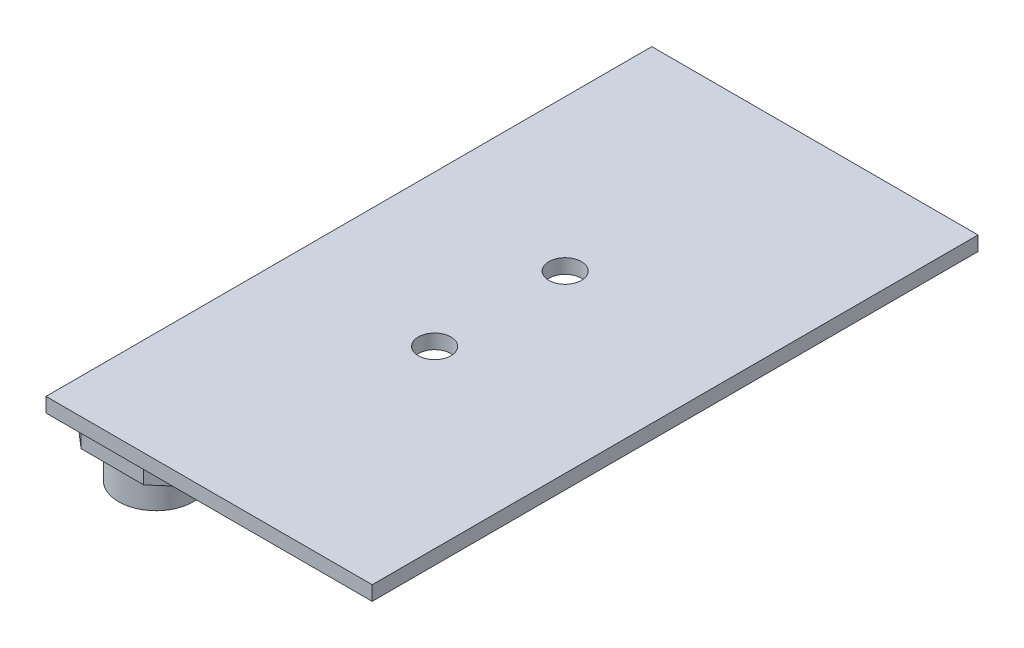
ISO-10303-21;
HEADER;
FILE_DESCRIPTION(('STEP AP214'),'2;1');
FILE_NAME('part.step','',(''),(''),'','','');
FILE_SCHEMA(('AUTOMOTIVE_DESIGN { 1 0 10303 214 1 1 1 1 }'));
ENDSEC;
DATA;
#1=APPLICATION_CONTEXT('core data for automotive mechanical design processes');
#2=APPLICATION_PROTOCOL_DEFINITION('international standard','automotive_design',2000,#1);
#3=PRODUCT_CONTEXT('',#1,'mechanical');
#4=PRODUCT('Part','Part','',(#3));
#5=PRODUCT_RELATED_PRODUCT_CATEGORY('part','',(#4));
#6=PRODUCT_DEFINITION_FORMATION('','',#4);
#7=PRODUCT_DEFINITION_CONTEXT('part definition',#1,'design');
#8=PRODUCT_DEFINITION('design','',#6,#7);
#9=PRODUCT_DEFINITION_SHAPE('','',#8);
#10=(LENGTH_UNIT() NAMED_UNIT(*) SI_UNIT(.MILLI.,.METRE.));
#11=(NAMED_UNIT(*) PLANE_ANGLE_UNIT() SI_UNIT($,.RADIAN.));
#12=(NAMED_UNIT(*) SI_UNIT($,.STERADIAN.) SOLID_ANGLE_UNIT());
#13=UNCERTAINTY_MEASURE_WITH_UNIT(LENGTH_MEASURE(1.E-05),#10,'distance_accuracy_value','');
#14=(GEOMETRIC_REPRESENTATION_CONTEXT(3) GLOBAL_UNCERTAINTY_ASSIGNED_CONTEXT((#13)) GLOBAL_UNIT_ASSIGNED_CONTEXT((#10,
#11,#12)) REPRESENTATION_CONTEXT('',''));
#15=CARTESIAN_POINT('',(0.,0.,0.));
#16=DIRECTION('',(0.,0.,1.));
#17=DIRECTION('',(1.,0.,0.));
#18=AXIS2_PLACEMENT_3D('',#15,#16,#17);
#19=CARTESIAN_POINT('',(0.,-2.375,0.));
#20=DIRECTION('',(0.,-1.,0.));
#21=DIRECTION('',(0.,0.,-1.));
#22=AXIS2_PLACEMENT_3D('',#19,#20,#21);
#23=PLANE('',#22);
#24=DIRECTION('',(-0.755489629176385,0.,-0.65516060642176));
#25=VECTOR('',#24,1.);
#26=CARTESIAN_POINT('',(-16.405,-2.375,32.33));
#27=LINE('',#26,#25);
#28=CARTESIAN_POINT('',(-16.405,-2.375,32.33));
#29=VERTEX_POINT('',#28);
#30=CARTESIAN_POINT('',(-19.53,-2.375,29.62));
#31=VERTEX_POINT('',#30);
#32=EDGE_CURVE('E157',#29,#31,#27,.T.);
#33=ORIENTED_EDGE('',*,*,#32,.T.);
#34=DIRECTION('',(0.,0.,-1.));
#35=VECTOR('',#34,1.);
#36=CARTESIAN_POINT('',(-19.53,-2.375,29.62));
#37=LINE('',#36,#35);
#38=CARTESIAN_POINT('',(-19.53,-2.375,25.68));
#39=VERTEX_POINT('',#38);
#40=EDGE_CURVE('E105',#31,#39,#37,.T.);
#41=ORIENTED_EDGE('',*,*,#40,.T.);
#42=DIRECTION('',(0.755489629176384,0.,-0.655160606421761));
#43=VECTOR('',#42,1.);
#44=CARTESIAN_POINT('',(-19.53,-2.375,25.68));
#45=LINE('',#44,#43);
#46=CARTESIAN_POINT('',(-16.405,-2.375,22.97));
#47=VERTEX_POINT('',#46);
#48=EDGE_CURVE('E172',#39,#47,#45,.T.);
#49=ORIENTED_EDGE('',*,*,#48,.T.);
#50=DIRECTION('',(1.,0.,0.));
#51=VECTOR('',#50,1.);
#52=CARTESIAN_POINT('',(-16.405,-2.375,22.97));
#53=LINE('',#52,#51);
#54=CARTESIAN_POINT('',(-9.685,-2.375,22.97));
#55=VERTEX_POINT('',#54);
#56=EDGE_CURVE('E184',#47,#55,#53,.T.);
#57=ORIENTED_EDGE('',*,*,#56,.T.);
#58=DIRECTION('',(0.755489629176385,0.,0.65516060642176));
#59=VECTOR('',#58,1.);
#60=CARTESIAN_POINT('',(-6.55999999999999,-2.375,25.68));
#61=LINE('',#60,#59);
#62=CARTESIAN_POINT('',(-6.55999999999999,-2.375,25.68));
#63=VERTEX_POINT('',#62);
#64=EDGE_CURVE('E124',#55,#63,#61,.T.);
#65=ORIENTED_EDGE('',*,*,#64,.T.);
#66=DIRECTION('',(0.,0.,1.));
#67=VECTOR('',#66,1.);
#68=CARTESIAN_POINT('',(-6.55999999999999,-2.375,29.62));
#69=LINE('',#68,#67);
#70=CARTESIAN_POINT('',(-6.55999999999999,-2.375,29.62));
#71=VERTEX_POINT('',#70);
#72=EDGE_CURVE('E118',#63,#71,#69,.T.);
#73=ORIENTED_EDGE('',*,*,#72,.T.);
#74=DIRECTION('',(-0.755489629176384,0.,0.65516060642176));
#75=VECTOR('',#74,1.);
#76=CARTESIAN_POINT('',(-9.685,-2.375,32.33));
#77=LINE('',#76,#75);
#78=CARTESIAN_POINT('',(-9.685,-2.375,32.33));
#79=VERTEX_POINT('',#78);
#80=EDGE_CURVE('E122',#71,#79,#77,.T.);
#81=ORIENTED_EDGE('',*,*,#80,.T.);
#82=DIRECTION('',(-1.,0.,0.));
#83=VECTOR('',#82,1.);
#84=CARTESIAN_POINT('',(-16.405,-2.375,32.33));
#85=LINE('',#84,#83);
#86=EDGE_CURVE('E62',#79,#29,#85,.T.);
#87=ORIENTED_EDGE('',*,*,#86,.T.);
#88=EDGE_LOOP('',(#33,#41,#49,#57,#65,#73,#81,#87));
#89=FACE_BOUND('',#88,.T.);
#90=CARTESIAN_POINT('',(-13.045,-2.375,27.65));
#91=DIRECTION('',(0.,-1.,0.));
#92=DIRECTION('',(0.,0.,-1.));
#93=AXIS2_PLACEMENT_3D('',#90,#91,#92);
#94=CIRCLE('',#93,4.);
#95=CARTESIAN_POINT('',(-13.045,-2.375,23.65));
#96=VERTEX_POINT('',#95);
#97=EDGE_CURVE('E190',#96,#96,#94,.T.);
#98=ORIENTED_EDGE('',*,*,#97,.F.);
#99=EDGE_LOOP('',(#98));
#100=FACE_BOUND('',#99,.T.);
#101=ADVANCED_FACE('F45',(#89,#100),#23,.T.);
#102=CARTESIAN_POINT('',(-16.405,-2.375,32.33));
#103=DIRECTION('',(0.65516060642176,0.,-0.755489629176385));
#104=DIRECTION('',(-0.755489629176385,0.,-0.65516060642176));
#105=AXIS2_PLACEMENT_3D('',#102,#103,#104);
#106=PLANE('',#105);
#107=DIRECTION('',(-0.755489629176385,0.,-0.65516060642176));
#108=VECTOR('',#107,1.);
#109=CARTESIAN_POINT('',(-16.405,-0.775,32.33));
#110=LINE('',#109,#108);
#111=CARTESIAN_POINT('',(-16.405,-0.775,32.33));
#112=VERTEX_POINT('',#111);
#113=CARTESIAN_POINT('',(-19.53,-0.775,29.62));
#114=VERTEX_POINT('',#113);
#115=EDGE_CURVE('E142',#112,#114,#110,.T.);
#116=ORIENTED_EDGE('',*,*,#115,.T.);
#117=DIRECTION('',(0.,1.,0.));
#118=VECTOR('',#117,1.);
#119=CARTESIAN_POINT('',(-19.53,-2.375,29.62));
#120=LINE('',#119,#118);
#121=EDGE_CURVE('E12',#31,#114,#120,.T.);
#122=ORIENTED_EDGE('',*,*,#121,.F.);
#123=ORIENTED_EDGE('',*,*,#32,.F.);
#124=DIRECTION('',(0.,1.,0.));
#125=VECTOR('',#124,1.);
#126=CARTESIAN_POINT('',(-16.405,-2.375,32.33));
#127=LINE('',#126,#125);
#128=EDGE_CURVE('E138',#29,#112,#127,.T.);
#129=ORIENTED_EDGE('',*,*,#128,.T.);
#130=EDGE_LOOP('',(#116,#122,#123,#129));
#131=FACE_BOUND('',#130,.T.);
#132=ADVANCED_FACE('F47',(#131),#106,.F.);
#133=CARTESIAN_POINT('',(-19.53,-2.375,29.62));
#134=DIRECTION('',(1.,0.,0.));
#135=DIRECTION('',(0.,0.,-1.));
#136=AXIS2_PLACEMENT_3D('',#133,#134,#135);
#137=PLANE('',#136);
#138=DIRECTION('',(0.,0.,-1.));
#139=VECTOR('',#138,1.);
#140=CARTESIAN_POINT('',(-19.53,-0.775,29.62));
#141=LINE('',#140,#139);
#142=CARTESIAN_POINT('',(-19.53,-0.775,25.68));
#143=VERTEX_POINT('',#142);
#144=EDGE_CURVE('E145',#114,#143,#141,.T.);
#145=ORIENTED_EDGE('',*,*,#144,.T.);
#146=DIRECTION('',(0.,1.,0.));
#147=VECTOR('',#146,1.);
#148=CARTESIAN_POINT('',(-19.53,-2.375,25.68));
#149=LINE('',#148,#147);
#150=EDGE_CURVE('E54',#39,#143,#149,.T.);
#151=ORIENTED_EDGE('',*,*,#150,.F.);
#152=ORIENTED_EDGE('',*,*,#40,.F.);
#153=ORIENTED_EDGE('',*,*,#121,.T.);
#154=EDGE_LOOP('',(#145,#151,#152,#153));
#155=FACE_BOUND('',#154,.T.);
#156=ADVANCED_FACE('F208',(#155),#137,.F.);
#157=CARTESIAN_POINT('',(-19.53,-2.375,25.68));
#158=DIRECTION('',(0.655160606421761,0.,0.755489629176384));
#159=DIRECTION('',(0.755489629176384,0.,-0.655160606421761));
#160=AXIS2_PLACEMENT_3D('',#157,#158,#159);
#161=PLANE('',#160);
#162=DIRECTION('',(0.755489629176384,0.,-0.655160606421761));
#163=VECTOR('',#162,1.);
#164=CARTESIAN_POINT('',(-19.53,-0.775,25.68));
#165=LINE('',#164,#163);
#166=CARTESIAN_POINT('',(-16.405,-0.775,22.97));
#167=VERTEX_POINT('',#166);
#168=EDGE_CURVE('E148',#143,#167,#165,.T.);
#169=ORIENTED_EDGE('',*,*,#168,.T.);
#170=DIRECTION('',(0.,1.,0.));
#171=VECTOR('',#170,1.);
#172=CARTESIAN_POINT('',(-16.405,-2.375,22.97));
#173=LINE('',#172,#171);
#174=EDGE_CURVE('E164',#47,#167,#173,.T.);
#175=ORIENTED_EDGE('',*,*,#174,.F.);
#176=ORIENTED_EDGE('',*,*,#48,.F.);
#177=ORIENTED_EDGE('',*,*,#150,.T.);
#178=EDGE_LOOP('',(#169,#175,#176,#177));
#179=FACE_BOUND('',#178,.T.);
#180=ADVANCED_FACE('F170',(#179),#161,.F.);
#181=CARTESIAN_POINT('',(-16.405,-2.375,22.97));
#182=DIRECTION('',(0.,0.,1.));
#183=DIRECTION('',(1.,0.,0.));
#184=AXIS2_PLACEMENT_3D('',#181,#182,#183);
#185=PLANE('',#184);
#186=DIRECTION('',(1.,0.,0.));
#187=VECTOR('',#186,1.);
#188=CARTESIAN_POINT('',(-16.405,-0.775,22.97));
#189=LINE('',#188,#187);
#190=CARTESIAN_POINT('',(-9.685,-0.775,22.97));
#191=VERTEX_POINT('',#190);
#192=EDGE_CURVE('E150',#167,#191,#189,.T.);
#193=ORIENTED_EDGE('',*,*,#192,.T.);
#194=DIRECTION('',(0.,1.,0.));
#195=VECTOR('',#194,1.);
#196=CARTESIAN_POINT('',(-9.685,-2.375,22.97));
#197=LINE('',#196,#195);
#198=EDGE_CURVE('E161',#55,#191,#197,.T.);
#199=ORIENTED_EDGE('',*,*,#198,.F.);
#200=ORIENTED_EDGE('',*,*,#56,.F.);
#201=ORIENTED_EDGE('',*,*,#174,.T.);
#202=EDGE_LOOP('',(#193,#199,#200,#201));
#203=FACE_BOUND('',#202,.T.);
#204=ADVANCED_FACE('F180',(#203),#185,.F.);
#205=CARTESIAN_POINT('',(-6.55999999999999,-2.375,25.68));
#206=DIRECTION('',(-0.65516060642176,0.,0.755489629176385));
#207=DIRECTION('',(0.755489629176385,0.,0.65516060642176));
#208=AXIS2_PLACEMENT_3D('',#205,#206,#207);
#209=PLANE('',#208);
#210=DIRECTION('',(0.755489629176385,0.,0.65516060642176));
#211=VECTOR('',#210,1.);
#212=CARTESIAN_POINT('',(-6.55999999999999,-0.775,25.68));
#213=LINE('',#212,#211);
#214=CARTESIAN_POINT('',(-6.55999999999999,-0.775,25.68));
#215=VERTEX_POINT('',#214);
#216=EDGE_CURVE('E152',#191,#215,#213,.T.);
#217=ORIENTED_EDGE('',*,*,#216,.T.);
#218=DIRECTION('',(0.,1.,0.));
#219=VECTOR('',#218,1.);
#220=CARTESIAN_POINT('',(-6.55999999999999,-2.375,25.68));
#221=LINE('',#220,#219);
#222=EDGE_CURVE('E133',#63,#215,#221,.T.);
#223=ORIENTED_EDGE('',*,*,#222,.F.);
#224=ORIENTED_EDGE('',*,*,#64,.F.);
#225=ORIENTED_EDGE('',*,*,#198,.T.);
#226=EDGE_LOOP('',(#217,#223,#224,#225));
#227=FACE_BOUND('',#226,.T.);
#228=ADVANCED_FACE('F183',(#227),#209,.F.);
#229=CARTESIAN_POINT('',(-6.55999999999999,-2.375,29.62));
#230=DIRECTION('',(-1.,0.,0.));
#231=DIRECTION('',(0.,0.,1.));
#232=AXIS2_PLACEMENT_3D('',#229,#230,#231);
#233=PLANE('',#232);
#234=DIRECTION('',(0.,0.,1.));
#235=VECTOR('',#234,1.);
#236=CARTESIAN_POINT('',(-6.55999999999999,-0.775,29.62));
#237=LINE('',#236,#235);
#238=CARTESIAN_POINT('',(-6.55999999999999,-0.775,29.62));
#239=VERTEX_POINT('',#238);
#240=EDGE_CURVE('E132',#215,#239,#237,.T.);
#241=ORIENTED_EDGE('',*,*,#240,.T.);
#242=DIRECTION('',(0.,1.,0.));
#243=VECTOR('',#242,1.);
#244=CARTESIAN_POINT('',(-6.55999999999999,-2.375,29.62));
#245=LINE('',#244,#243);
#246=EDGE_CURVE('E129',#71,#239,#245,.T.);
#247=ORIENTED_EDGE('',*,*,#246,.F.);
#248=ORIENTED_EDGE('',*,*,#72,.F.);
#249=ORIENTED_EDGE('',*,*,#222,.T.);
#250=EDGE_LOOP('',(#241,#247,#248,#249));
#251=FACE_BOUND('',#250,.T.);
#252=ADVANCED_FACE('F130',(#251),#233,.F.);
#253=CARTESIAN_POINT('',(-9.685,-2.375,32.33));
#254=DIRECTION('',(-0.65516060642176,0.,-0.755489629176384));
#255=DIRECTION('',(-0.755489629176385,0.,0.655160606421761));
#256=AXIS2_PLACEMENT_3D('',#253,#254,#255);
#257=PLANE('',#256);
#258=DIRECTION('',(-0.755489629176384,0.,0.65516060642176));
#259=VECTOR('',#258,1.);
#260=CARTESIAN_POINT('',(-9.685,-0.775,32.33));
#261=LINE('',#260,#259);
#262=CARTESIAN_POINT('',(-9.685,-0.775,32.33));
#263=VERTEX_POINT('',#262);
#264=EDGE_CURVE('E91',#239,#263,#261,.T.);
#265=ORIENTED_EDGE('',*,*,#264,.T.);
#266=DIRECTION('',(0.,1.,0.));
#267=VECTOR('',#266,1.);
#268=CARTESIAN_POINT('',(-9.685,-2.375,32.33));
#269=LINE('',#268,#267);
#270=EDGE_CURVE('E134',#79,#263,#269,.T.);
#271=ORIENTED_EDGE('',*,*,#270,.F.);
#272=ORIENTED_EDGE('',*,*,#80,.F.);
#273=ORIENTED_EDGE('',*,*,#246,.T.);
#274=EDGE_LOOP('',(#265,#271,#272,#273));
#275=FACE_BOUND('',#274,.T.);
#276=ADVANCED_FACE('F136',(#275),#257,.F.);
#277=CARTESIAN_POINT('',(-16.405,-2.375,32.33));
#278=DIRECTION('',(0.,0.,-1.));
#279=DIRECTION('',(-1.,0.,0.));
#280=AXIS2_PLACEMENT_3D('',#277,#278,#279);
#281=PLANE('',#280);
#282=DIRECTION('',(-1.,0.,0.));
#283=VECTOR('',#282,1.);
#284=CARTESIAN_POINT('',(-16.405,-0.775,32.33));
#285=LINE('',#284,#283);
#286=EDGE_CURVE('E97',#263,#112,#285,.T.);
#287=ORIENTED_EDGE('',*,*,#286,.T.);
#288=ORIENTED_EDGE('',*,*,#128,.F.);
#289=ORIENTED_EDGE('',*,*,#86,.F.);
#290=ORIENTED_EDGE('',*,*,#270,.T.);
#291=EDGE_LOOP('',(#287,#288,#289,#290));
#292=FACE_BOUND('',#291,.T.);
#293=ADVANCED_FACE('F214',(#292),#281,.F.);
#294=CARTESIAN_POINT('',(0.,-0.775,0.));
#295=DIRECTION('',(0.,-1.,0.));
#296=DIRECTION('',(0.,0.,-1.));
#297=AXIS2_PLACEMENT_3D('',#294,#295,#296);
#298=PLANE('',#297);
#299=ORIENTED_EDGE('',*,*,#115,.F.);
#300=ORIENTED_EDGE('',*,*,#286,.F.);
#301=ORIENTED_EDGE('',*,*,#264,.F.);
#302=ORIENTED_EDGE('',*,*,#240,.F.);
#303=ORIENTED_EDGE('',*,*,#216,.F.);
#304=ORIENTED_EDGE('',*,*,#192,.F.);
#305=ORIENTED_EDGE('',*,*,#168,.F.);
#306=ORIENTED_EDGE('',*,*,#144,.F.);
#307=EDGE_LOOP('',(#299,#300,#301,#302,#303,#304,#305,#306));
#308=FACE_BOUND('',#307,.T.);
#309=ADVANCED_FACE('F176',(#308),#298,.F.);
#310=CARTESIAN_POINT('',(-13.045,-5.975,27.65));
#311=DIRECTION('',(0.,1.,0.));
#312=DIRECTION('',(0.,0.,1.));
#313=AXIS2_PLACEMENT_3D('',#310,#311,#312);
#314=CYLINDRICAL_SURFACE('',#313,4.);
#315=CARTESIAN_POINT('',(-13.045,-5.975,27.65));
#316=DIRECTION('',(0.,-1.,0.));
#317=DIRECTION('',(0.,0.,-1.));
#318=AXIS2_PLACEMENT_3D('',#315,#316,#317);
#319=CIRCLE('',#318,4.);
#320=CARTESIAN_POINT('',(-13.045,-5.975,23.65));
#321=VERTEX_POINT('',#320);
#322=EDGE_CURVE('E146',#321,#321,#319,.T.);
#323=ORIENTED_EDGE('',*,*,#322,.F.);
#324=EDGE_LOOP('',(#323));
#325=FACE_BOUND('',#324,.T.);
#326=ORIENTED_EDGE('',*,*,#97,.T.);
#327=EDGE_LOOP('',(#326));
#328=FACE_BOUND('',#327,.T.);
#329=ADVANCED_FACE('F198',(#325,#328),#314,.T.);
#330=CARTESIAN_POINT('',(-13.045,-5.975,27.65));
#331=DIRECTION('',(0.,-1.,0.));
#332=DIRECTION('',(0.,0.,-1.));
#333=AXIS2_PLACEMENT_3D('',#330,#331,#332);
#334=PLANE('',#333);
#335=ORIENTED_EDGE('',*,*,#322,.T.);
#336=EDGE_LOOP('',(#335));
#337=FACE_BOUND('',#336,.T.);
#338=ADVANCED_FACE('F196',(#337),#334,.T.);
#339=CLOSED_SHELL('',(#101,#132,#156,#180,#204,#228,#252,#276,#293,#309,#329,#338));
#340=MANIFOLD_SOLID_BREP('B2',#339);
#341=CARTESIAN_POINT('',(-19.18,-4.325,19.33));
#342=DIRECTION('',(1.,0.,0.));
#343=DIRECTION('',(0.,0.,-1.));
#344=AXIS2_PLACEMENT_3D('',#341,#342,#343);
#345=PLANE('',#344);
#346=DIRECTION('',(0.,0.,-1.));
#347=VECTOR('',#346,1.);
#348=CARTESIAN_POINT('',(-19.18,-0.775,19.33));
#349=LINE('',#348,#347);
#350=CARTESIAN_POINT('',(-19.18,-0.775,19.33));
#351=VERTEX_POINT('',#350);
#352=CARTESIAN_POINT('',(-19.18,-0.775,11.93));
#353=VERTEX_POINT('',#352);
#354=EDGE_CURVE('E374',#351,#353,#349,.T.);
#355=ORIENTED_EDGE('',*,*,#354,.T.);
#356=DIRECTION('',(0.,1.,0.));
#357=VECTOR('',#356,1.);
#358=CARTESIAN_POINT('',(-19.18,-4.325,11.93));
#359=LINE('',#358,#357);
#360=CARTESIAN_POINT('',(-19.18,-4.325,11.93));
#361=VERTEX_POINT('',#360);
#362=EDGE_CURVE('E43',#361,#353,#359,.T.);
#363=ORIENTED_EDGE('',*,*,#362,.F.);
#364=DIRECTION('',(0.,0.,-1.));
#365=VECTOR('',#364,1.);
#366=CARTESIAN_POINT('',(-19.18,-4.325,19.33));
#367=LINE('',#366,#365);
#368=CARTESIAN_POINT('',(-19.18,-4.325,19.33));
#369=VERTEX_POINT('',#368);
#370=EDGE_CURVE('E362',#369,#361,#367,.T.);
#371=ORIENTED_EDGE('',*,*,#370,.F.);
#372=DIRECTION('',(0.,1.,0.));
#373=VECTOR('',#372,1.);
#374=CARTESIAN_POINT('',(-19.18,-4.325,19.33));
#375=LINE('',#374,#373);
#376=EDGE_CURVE('E370',#369,#351,#375,.T.);
#377=ORIENTED_EDGE('',*,*,#376,.T.);
#378=EDGE_LOOP('',(#355,#363,#371,#377));
#379=FACE_BOUND('',#378,.T.);
#380=ADVANCED_FACE('F311',(#379),#345,.F.);
#381=CARTESIAN_POINT('',(-19.18,-4.325,11.93));
#382=DIRECTION('',(0.,0.,1.));
#383=DIRECTION('',(1.,0.,0.));
#384=AXIS2_PLACEMENT_3D('',#381,#382,#383);
#385=PLANE('',#384);
#386=DIRECTION('',(1.,0.,0.));
#387=VECTOR('',#386,1.);
#388=CARTESIAN_POINT('',(-19.18,-0.775,11.93));
#389=LINE('',#388,#387);
#390=CARTESIAN_POINT('',(-11.78,-0.775,11.93));
#391=VERTEX_POINT('',#390);
#392=EDGE_CURVE('E366',#353,#391,#389,.T.);
#393=ORIENTED_EDGE('',*,*,#392,.T.);
#394=DIRECTION('',(0.,1.,0.));
#395=VECTOR('',#394,1.);
#396=CARTESIAN_POINT('',(-11.78,-4.325,11.93));
#397=LINE('',#396,#395);
#398=CARTESIAN_POINT('',(-11.78,-4.325,11.93));
#399=VERTEX_POINT('',#398);
#400=EDGE_CURVE('E319',#399,#391,#397,.T.);
#401=ORIENTED_EDGE('',*,*,#400,.F.);
#402=DIRECTION('',(1.,0.,0.));
#403=VECTOR('',#402,1.);
#404=CARTESIAN_POINT('',(-19.18,-4.325,11.93));
#405=LINE('',#404,#403);
#406=EDGE_CURVE('E357',#361,#399,#405,.T.);
#407=ORIENTED_EDGE('',*,*,#406,.F.);
#408=ORIENTED_EDGE('',*,*,#362,.T.);
#409=EDGE_LOOP('',(#393,#401,#407,#408));
#410=FACE_BOUND('',#409,.T.);
#411=ADVANCED_FACE('F365',(#410),#385,.F.);
#412=CARTESIAN_POINT('',(-11.78,-4.325,19.33));
#413=DIRECTION('',(-1.,0.,0.));
#414=DIRECTION('',(0.,0.,1.));
#415=AXIS2_PLACEMENT_3D('',#412,#413,#414);
#416=PLANE('',#415);
#417=DIRECTION('',(0.,0.,1.));
#418=VECTOR('',#417,1.);
#419=CARTESIAN_POINT('',(-11.78,-0.775,19.33));
#420=LINE('',#419,#418);
#421=CARTESIAN_POINT('',(-11.78,-0.775,19.33));
#422=VERTEX_POINT('',#421);
#423=EDGE_CURVE('E344',#391,#422,#420,.T.);
#424=ORIENTED_EDGE('',*,*,#423,.T.);
#425=DIRECTION('',(0.,1.,0.));
#426=VECTOR('',#425,1.);
#427=CARTESIAN_POINT('',(-11.78,-4.325,19.33));
#428=LINE('',#427,#426);
#429=CARTESIAN_POINT('',(-11.78,-4.325,19.33));
#430=VERTEX_POINT('',#429);
#431=EDGE_CURVE('E367',#430,#422,#428,.T.);
#432=ORIENTED_EDGE('',*,*,#431,.F.);
#433=DIRECTION('',(0.,0.,1.));
#434=VECTOR('',#433,1.);
#435=CARTESIAN_POINT('',(-11.78,-4.325,19.33));
#436=LINE('',#435,#434);
#437=EDGE_CURVE('E360',#399,#430,#436,.T.);
#438=ORIENTED_EDGE('',*,*,#437,.F.);
#439=ORIENTED_EDGE('',*,*,#400,.T.);
#440=EDGE_LOOP('',(#424,#432,#438,#439));
#441=FACE_BOUND('',#440,.T.);
#442=ADVANCED_FACE('F368',(#441),#416,.F.);
#443=CARTESIAN_POINT('',(-19.18,-4.325,19.33));
#444=DIRECTION('',(0.,0.,-1.));
#445=DIRECTION('',(-1.,0.,0.));
#446=AXIS2_PLACEMENT_3D('',#443,#444,#445);
#447=PLANE('',#446);
#448=DIRECTION('',(-1.,0.,0.));
#449=VECTOR('',#448,1.);
#450=CARTESIAN_POINT('',(-19.18,-0.775,19.33));
#451=LINE('',#450,#449);
#452=EDGE_CURVE('E350',#422,#351,#451,.T.);
#453=ORIENTED_EDGE('',*,*,#452,.T.);
#454=ORIENTED_EDGE('',*,*,#376,.F.);
#455=DIRECTION('',(-1.,0.,0.));
#456=VECTOR('',#455,1.);
#457=CARTESIAN_POINT('',(-19.18,-4.325,19.33));
#458=LINE('',#457,#456);
#459=EDGE_CURVE('E327',#430,#369,#458,.T.);
#460=ORIENTED_EDGE('',*,*,#459,.F.);
#461=ORIENTED_EDGE('',*,*,#431,.T.);
#462=EDGE_LOOP('',(#453,#454,#460,#461));
#463=FACE_BOUND('',#462,.T.);
#464=ADVANCED_FACE('F381',(#463),#447,.F.);
#465=CARTESIAN_POINT('',(0.,-4.325,0.));
#466=DIRECTION('',(0.,-1.,0.));
#467=DIRECTION('',(0.,0.,-1.));
#468=AXIS2_PLACEMENT_3D('',#465,#466,#467);
#469=PLANE('',#468);
#470=ORIENTED_EDGE('',*,*,#370,.T.);
#471=ORIENTED_EDGE('',*,*,#406,.T.);
#472=ORIENTED_EDGE('',*,*,#437,.T.);
#473=ORIENTED_EDGE('',*,*,#459,.T.);
#474=EDGE_LOOP('',(#470,#471,#472,#473));
#475=FACE_BOUND('',#474,.T.);
#476=ADVANCED_FACE('F358',(#475),#469,.T.);
#477=CARTESIAN_POINT('',(0.,-0.775,0.));
#478=DIRECTION('',(0.,-1.,0.));
#479=DIRECTION('',(0.,0.,-1.));
#480=AXIS2_PLACEMENT_3D('',#477,#478,#479);
#481=PLANE('',#480);
#482=ORIENTED_EDGE('',*,*,#354,.F.);
#483=ORIENTED_EDGE('',*,*,#452,.F.);
#484=ORIENTED_EDGE('',*,*,#423,.F.);
#485=ORIENTED_EDGE('',*,*,#392,.F.);
#486=EDGE_LOOP('',(#482,#483,#484,#485));
#487=FACE_BOUND('',#486,.T.);
#488=ADVANCED_FACE('F384',(#487),#481,.F.);
#489=CLOSED_SHELL('',(#380,#411,#442,#464,#476,#488));
#490=MANIFOLD_SOLID_BREP('B6',#489);
#491=CARTESIAN_POINT('',(-20.,0.775,-32.5));
#492=DIRECTION('',(1.,0.,0.));
#493=DIRECTION('',(0.,0.,-1.));
#494=AXIS2_PLACEMENT_3D('',#491,#492,#493);
#495=PLANE('',#494);
#496=DIRECTION('',(0.,0.,1.));
#497=VECTOR('',#496,1.);
#498=CARTESIAN_POINT('',(-20.,-0.775,-32.5));
#499=LINE('',#498,#497);
#500=CARTESIAN_POINT('',(-20.,-0.775,-32.5));
#501=VERTEX_POINT('',#500);
#502=CARTESIAN_POINT('',(-20.,-0.775,32.5));
#503=VERTEX_POINT('',#502);
#504=EDGE_CURVE('E497',#501,#503,#499,.T.);
#505=ORIENTED_EDGE('',*,*,#504,.T.);
#506=DIRECTION('',(0.,-1.,0.));
#507=VECTOR('',#506,1.);
#508=CARTESIAN_POINT('',(-20.,0.775,32.5));
#509=LINE('',#508,#507);
#510=CARTESIAN_POINT('',(-20.,0.775,32.5));
#511=VERTEX_POINT('',#510);
#512=EDGE_CURVE('E309',#511,#503,#509,.T.);
#513=ORIENTED_EDGE('',*,*,#512,.F.);
#514=DIRECTION('',(0.,0.,1.));
#515=VECTOR('',#514,1.);
#516=CARTESIAN_POINT('',(-20.,0.775,-32.5));
#517=LINE('',#516,#515);
#518=CARTESIAN_POINT('',(-20.,0.775,-32.5));
#519=VERTEX_POINT('',#518);
#520=EDGE_CURVE('E485',#519,#511,#517,.T.);
#521=ORIENTED_EDGE('',*,*,#520,.F.);
#522=DIRECTION('',(0.,-1.,0.));
#523=VECTOR('',#522,1.);
#524=CARTESIAN_POINT('',(-20.,0.775,-32.5));
#525=LINE('',#524,#523);
#526=EDGE_CURVE('E493',#519,#501,#525,.T.);
#527=ORIENTED_EDGE('',*,*,#526,.T.);
#528=EDGE_LOOP('',(#505,#513,#521,#527));
#529=FACE_BOUND('',#528,.T.);
#530=ADVANCED_FACE('F434',(#529),#495,.F.);
#531=CARTESIAN_POINT('',(-20.,0.775,32.5));
#532=DIRECTION('',(0.,0.,-1.));
#533=DIRECTION('',(-1.,0.,0.));
#534=AXIS2_PLACEMENT_3D('',#531,#532,#533);
#535=PLANE('',#534);
#536=DIRECTION('',(1.,0.,0.));
#537=VECTOR('',#536,1.);
#538=CARTESIAN_POINT('',(-20.,-0.775,32.5));
#539=LINE('',#538,#537);
#540=CARTESIAN_POINT('',(15.,-0.775,32.5));
#541=VERTEX_POINT('',#540);
#542=EDGE_CURVE('E489',#503,#541,#539,.T.);
#543=ORIENTED_EDGE('',*,*,#542,.T.);
#544=DIRECTION('',(0.,-1.,0.));
#545=VECTOR('',#544,1.);
#546=CARTESIAN_POINT('',(15.,0.775,32.5));
#547=LINE('',#546,#545);
#548=CARTESIAN_POINT('',(15.,0.775,32.5));
#549=VERTEX_POINT('',#548);
#550=EDGE_CURVE('E442',#549,#541,#547,.T.);
#551=ORIENTED_EDGE('',*,*,#550,.F.);
#552=DIRECTION('',(1.,0.,0.));
#553=VECTOR('',#552,1.);
#554=CARTESIAN_POINT('',(-20.,0.775,32.5));
#555=LINE('',#554,#553);
#556=EDGE_CURVE('E480',#511,#549,#555,.T.);
#557=ORIENTED_EDGE('',*,*,#556,.F.);
#558=ORIENTED_EDGE('',*,*,#512,.T.);
#559=EDGE_LOOP('',(#543,#551,#557,#558));
#560=FACE_BOUND('',#559,.T.);
#561=ADVANCED_FACE('F488',(#560),#535,.F.);
#562=CARTESIAN_POINT('',(15.,0.775,-32.5));
#563=DIRECTION('',(-1.,0.,0.));
#564=DIRECTION('',(0.,0.,1.));
#565=AXIS2_PLACEMENT_3D('',#562,#563,#564);
#566=PLANE('',#565);
#567=DIRECTION('',(0.,0.,-1.));
#568=VECTOR('',#567,1.);
#569=CARTESIAN_POINT('',(15.,-0.775,-32.5));
#570=LINE('',#569,#568);
#571=CARTESIAN_POINT('',(15.,-0.775,-32.5));
#572=VERTEX_POINT('',#571);
#573=EDGE_CURVE('E467',#541,#572,#570,.T.);
#574=ORIENTED_EDGE('',*,*,#573,.T.);
#575=DIRECTION('',(0.,-1.,0.));
#576=VECTOR('',#575,1.);
#577=CARTESIAN_POINT('',(15.,0.775,-32.5));
#578=LINE('',#577,#576);
#579=CARTESIAN_POINT('',(15.,0.775,-32.5));
#580=VERTEX_POINT('',#579);
#581=EDGE_CURVE('E490',#580,#572,#578,.T.);
#582=ORIENTED_EDGE('',*,*,#581,.F.);
#583=DIRECTION('',(0.,0.,-1.));
#584=VECTOR('',#583,1.);
#585=CARTESIAN_POINT('',(15.,0.775,-32.5));
#586=LINE('',#585,#584);
#587=EDGE_CURVE('E483',#549,#580,#586,.T.);
#588=ORIENTED_EDGE('',*,*,#587,.F.);
#589=ORIENTED_EDGE('',*,*,#550,.T.);
#590=EDGE_LOOP('',(#574,#582,#588,#589));
#591=FACE_BOUND('',#590,.T.);
#592=ADVANCED_FACE('F491',(#591),#566,.F.);
#593=CARTESIAN_POINT('',(-20.,0.775,-32.5));
#594=DIRECTION('',(0.,0.,1.));
#595=DIRECTION('',(1.,0.,0.));
#596=AXIS2_PLACEMENT_3D('',#593,#594,#595);
#597=PLANE('',#596);
#598=DIRECTION('',(-1.,0.,0.));
#599=VECTOR('',#598,1.);
#600=CARTESIAN_POINT('',(-20.,-0.775,-32.5));
#601=LINE('',#600,#599);
#602=EDGE_CURVE('E473',#572,#501,#601,.T.);
#603=ORIENTED_EDGE('',*,*,#602,.T.);
#604=ORIENTED_EDGE('',*,*,#526,.F.);
#605=DIRECTION('',(-1.,0.,0.));
#606=VECTOR('',#605,1.);
#607=CARTESIAN_POINT('',(-20.,0.775,-32.5));
#608=LINE('',#607,#606);
#609=EDGE_CURVE('E450',#580,#519,#608,.T.);
#610=ORIENTED_EDGE('',*,*,#609,.F.);
#611=ORIENTED_EDGE('',*,*,#581,.T.);
#612=EDGE_LOOP('',(#603,#604,#610,#611));
#613=FACE_BOUND('',#612,.T.);
#614=ADVANCED_FACE('F505',(#613),#597,.F.);
#615=CARTESIAN_POINT('',(0.,0.775,0.));
#616=DIRECTION('',(0.,1.,0.));
#617=DIRECTION('',(0.,0.,1.));
#618=AXIS2_PLACEMENT_3D('',#615,#616,#617);
#619=PLANE('',#618);
#620=CARTESIAN_POINT('',(-3.8,0.775,-7.));
#621=DIRECTION('',(0.,-1.,0.));
#622=DIRECTION('',(0.,0.,1.));
#623=AXIS2_PLACEMENT_3D('',#620,#621,#622);
#624=CIRCLE('',#623,1.75000000000001);
#625=CARTESIAN_POINT('',(-3.8,0.775,-8.75000000000001));
#626=VERTEX_POINT('',#625);
#627=EDGE_CURVE('E514',#626,#626,#624,.T.);
#628=ORIENTED_EDGE('',*,*,#627,.T.);
#629=EDGE_LOOP('',(#628));
#630=FACE_BOUND('',#629,.T.);
#631=CARTESIAN_POINT('',(-3.8,0.775,7.));
#632=DIRECTION('',(0.,-1.,0.));
#633=DIRECTION('',(0.,0.,-1.));
#634=AXIS2_PLACEMENT_3D('',#631,#632,#633);
#635=CIRCLE('',#634,1.75000000000001);
#636=CARTESIAN_POINT('',(-3.8,0.775,5.24999999999999));
#637=VERTEX_POINT('',#636);
#638=EDGE_CURVE('E500',#637,#637,#635,.T.);
#639=ORIENTED_EDGE('',*,*,#638,.T.);
#640=EDGE_LOOP('',(#639));
#641=FACE_BOUND('',#640,.T.);
#642=ORIENTED_EDGE('',*,*,#520,.T.);
#643=ORIENTED_EDGE('',*,*,#556,.T.);
#644=ORIENTED_EDGE('',*,*,#587,.T.);
#645=ORIENTED_EDGE('',*,*,#609,.T.);
#646=EDGE_LOOP('',(#642,#643,#644,#645));
#647=FACE_BOUND('',#646,.T.);
#648=ADVANCED_FACE('F481',(#630,#641,#647),#619,.T.);
#649=CARTESIAN_POINT('',(0.,-0.775,0.));
#650=DIRECTION('',(0.,1.,0.));
#651=DIRECTION('',(0.,0.,1.));
#652=AXIS2_PLACEMENT_3D('',#649,#650,#651);
#653=PLANE('',#652);
#654=CARTESIAN_POINT('',(-3.8,-0.775,-7.));
#655=DIRECTION('',(0.,-1.,0.));
#656=DIRECTION('',(0.,0.,1.));
#657=AXIS2_PLACEMENT_3D('',#654,#655,#656);
#658=CIRCLE('',#657,1.75000000000001);
#659=CARTESIAN_POINT('',(-3.8,-0.775,-8.75000000000001));
#660=VERTEX_POINT('',#659);
#661=EDGE_CURVE('E517',#660,#660,#658,.T.);
#662=ORIENTED_EDGE('',*,*,#661,.F.);
#663=EDGE_LOOP('',(#662));
#664=FACE_BOUND('',#663,.T.);
#665=CARTESIAN_POINT('',(-3.8,-0.775,7.));
#666=DIRECTION('',(0.,-1.,0.));
#667=DIRECTION('',(0.,0.,-1.));
#668=AXIS2_PLACEMENT_3D('',#665,#666,#667);
#669=CIRCLE('',#668,1.75000000000001);
#670=CARTESIAN_POINT('',(-3.8,-0.775,5.24999999999999));
#671=VERTEX_POINT('',#670);
#672=EDGE_CURVE('E511',#671,#671,#669,.T.);
#673=ORIENTED_EDGE('',*,*,#672,.F.);
#674=EDGE_LOOP('',(#673));
#675=FACE_BOUND('',#674,.T.);
#676=ORIENTED_EDGE('',*,*,#504,.F.);
#677=ORIENTED_EDGE('',*,*,#602,.F.);
#678=ORIENTED_EDGE('',*,*,#573,.F.);
#679=ORIENTED_EDGE('',*,*,#542,.F.);
#680=EDGE_LOOP('',(#676,#677,#678,#679));
#681=FACE_BOUND('',#680,.T.);
#682=ADVANCED_FACE('F508',(#664,#675,#681),#653,.F.);
#683=CARTESIAN_POINT('',(-3.8,0.775,7.));
#684=DIRECTION('',(0.,-1.,0.));
#685=DIRECTION('',(0.,0.,-1.));
#686=AXIS2_PLACEMENT_3D('',#683,#684,#685);
#687=CYLINDRICAL_SURFACE('',#686,1.75000000000001);
#688=CARTESIAN_POINT('',(-3.8,0.775,5.24999999999999));
#689=CARTESIAN_POINT('',(-3.8,0.758854166666667,5.24999999999999));
#690=CARTESIAN_POINT('',(-3.8,0.742708333333333,5.24999999999999));
#691=CARTESIAN_POINT('',(-3.8,0.710416666666667,5.24999999999999));
#692=CARTESIAN_POINT('',(-3.8,0.694270833333333,5.24999999999999));
#693=CARTESIAN_POINT('',(-3.8,0.661979166666667,5.24999999999999));
#694=CARTESIAN_POINT('',(-3.8,0.645833333333333,5.24999999999999));
#695=CARTESIAN_POINT('',(-3.8,0.613541666666667,5.24999999999999));
#696=CARTESIAN_POINT('',(-3.8,0.597395833333333,5.24999999999999));
#697=CARTESIAN_POINT('',(-3.8,0.565104166666667,5.24999999999999));
#698=CARTESIAN_POINT('',(-3.8,0.548958333333333,5.24999999999999));
#699=CARTESIAN_POINT('',(-3.8,0.516666666666667,5.24999999999999));
#700=CARTESIAN_POINT('',(-3.8,0.500520833333333,5.24999999999999));
#701=CARTESIAN_POINT('',(-3.8,0.468229166666667,5.24999999999999));
#702=CARTESIAN_POINT('',(-3.8,0.452083333333333,5.24999999999999));
#703=CARTESIAN_POINT('',(-3.8,0.419791666666667,5.24999999999999));
#704=CARTESIAN_POINT('',(-3.8,0.403645833333333,5.24999999999999));
#705=CARTESIAN_POINT('',(-3.8,0.371354166666667,5.24999999999999));
#706=CARTESIAN_POINT('',(-3.8,0.355208333333333,5.24999999999999));
#707=CARTESIAN_POINT('',(-3.8,0.322916666666667,5.24999999999999));
#708=CARTESIAN_POINT('',(-3.8,0.306770833333333,5.24999999999999));
#709=CARTESIAN_POINT('',(-3.8,0.274479166666667,5.24999999999999));
#710=CARTESIAN_POINT('',(-3.8,0.258333333333333,5.24999999999999));
#711=CARTESIAN_POINT('',(-3.8,0.226041666666667,5.24999999999999));
#712=CARTESIAN_POINT('',(-3.8,0.209895833333333,5.24999999999999));
#713=CARTESIAN_POINT('',(-3.8,0.177604166666667,5.24999999999999));
#714=CARTESIAN_POINT('',(-3.8,0.161458333333333,5.24999999999999));
#715=CARTESIAN_POINT('',(-3.8,0.129166666666667,5.24999999999999));
#716=CARTESIAN_POINT('',(-3.8,0.113020833333333,5.24999999999999));
#717=CARTESIAN_POINT('',(-3.8,0.0807291666666667,5.24999999999999));
#718=CARTESIAN_POINT('',(-3.8,0.0645833333333334,5.24999999999999));
#719=CARTESIAN_POINT('',(-3.8,0.0322916666666668,5.24999999999999));
#720=CARTESIAN_POINT('',(-3.8,0.0161458333333334,5.24999999999999));
#721=CARTESIAN_POINT('',(-3.8,-0.0161458333333332,5.24999999999999));
#722=CARTESIAN_POINT('',(-3.8,-0.0322916666666665,5.24999999999999));
#723=CARTESIAN_POINT('',(-3.8,-0.0645833333333332,5.24999999999999));
#724=CARTESIAN_POINT('',(-3.8,-0.0807291666666665,5.24999999999999));
#725=CARTESIAN_POINT('',(-3.8,-0.113020833333333,5.24999999999999));
#726=CARTESIAN_POINT('',(-3.8,-0.129166666666667,5.24999999999999));
#727=CARTESIAN_POINT('',(-3.8,-0.161458333333333,5.24999999999999));
#728=CARTESIAN_POINT('',(-3.8,-0.177604166666667,5.24999999999999));
#729=CARTESIAN_POINT('',(-3.8,-0.209895833333333,5.24999999999999));
#730=CARTESIAN_POINT('',(-3.8,-0.226041666666667,5.24999999999999));
#731=CARTESIAN_POINT('',(-3.8,-0.258333333333333,5.24999999999999));
#732=CARTESIAN_POINT('',(-3.8,-0.274479166666667,5.24999999999999));
#733=CARTESIAN_POINT('',(-3.8,-0.306770833333333,5.24999999999999));
#734=CARTESIAN_POINT('',(-3.8,-0.322916666666667,5.24999999999999));
#735=CARTESIAN_POINT('',(-3.8,-0.355208333333333,5.24999999999999));
#736=CARTESIAN_POINT('',(-3.8,-0.371354166666667,5.24999999999999));
#737=CARTESIAN_POINT('',(-3.8,-0.403645833333333,5.24999999999999));
#738=CARTESIAN_POINT('',(-3.8,-0.419791666666667,5.24999999999999));
#739=CARTESIAN_POINT('',(-3.8,-0.452083333333333,5.24999999999999));
#740=CARTESIAN_POINT('',(-3.8,-0.468229166666667,5.24999999999999));
#741=CARTESIAN_POINT('',(-3.8,-0.500520833333333,5.24999999999999));
#742=CARTESIAN_POINT('',(-3.8,-0.516666666666667,5.24999999999999));
#743=CARTESIAN_POINT('',(-3.8,-0.548958333333333,5.24999999999999));
#744=CARTESIAN_POINT('',(-3.8,-0.565104166666667,5.24999999999999));
#745=CARTESIAN_POINT('',(-3.8,-0.597395833333333,5.24999999999999));
#746=CARTESIAN_POINT('',(-3.8,-0.613541666666667,5.24999999999999));
#747=CARTESIAN_POINT('',(-3.8,-0.645833333333333,5.24999999999999));
#748=CARTESIAN_POINT('',(-3.8,-0.661979166666667,5.24999999999999));
#749=CARTESIAN_POINT('',(-3.8,-0.694270833333333,5.24999999999999));
#750=CARTESIAN_POINT('',(-3.8,-0.710416666666667,5.24999999999999));
#751=CARTESIAN_POINT('',(-3.8,-0.742708333333333,5.24999999999999));
#752=CARTESIAN_POINT('',(-3.8,-0.758854166666667,5.24999999999999));
#753=CARTESIAN_POINT('',(-3.8,-0.775,5.24999999999999));
#754=B_SPLINE_CURVE_WITH_KNOTS('',3,(#688,#689,#690,#691,#692,#693,#694,#695,#696,#697,#698,
#699,#700,#701,#702,#703,#704,#705,#706,#707,#708,#709,#710,#711,#712,#713,#714,#715,#716,#717,
#718,#719,#720,#721,#722,#723,#724,#725,#726,#727,#728,#729,#730,#731,#732,#733,#734,#735,#736,
#737,#738,#739,#740,#741,#742,#743,#744,#745,#746,#747,#748,#749,#750,#751,#752,#753),
.UNSPECIFIED.,.F.,.F.,(4,2,2,2,2,2,2,2,2,2,2,2,2,2,2,2,2,2,2,2,2,2,2,2,2,2,2,2,2,2,2,2,4),(0.,
0.0484375000000001,0.0968750000000001,0.1453125,0.19375,0.2421875,0.290625,0.3390625,0.3875,
0.4359375,0.484375,0.5328125,0.58125,0.6296875,0.678125,0.7265625,0.775,0.8234375,0.871875,
0.9203125,0.96875,1.0171875,1.065625,1.1140625,1.1625,1.2109375,1.259375,1.3078125,1.35625,
1.4046875,1.453125,1.5015625,1.55),.UNSPECIFIED.);
#755=EDGE_CURVE('BSEAM528',#637,#671,#754,.T.);
#756=ORIENTED_EDGE('',*,*,#638,.F.);
#757=ORIENTED_EDGE('',*,*,#672,.T.);
#758=ORIENTED_EDGE('',*,*,#755,.T.);
#759=ORIENTED_EDGE('',*,*,#755,.F.);
#760=EDGE_LOOP('',(#756,#758,#757,#759));
#761=FACE_BOUND('',#760,.T.);
#762=ADVANCED_FACE('F528',(#761),#687,.F.);
#763=CARTESIAN_POINT('',(-3.8,0.775,-7.));
#764=DIRECTION('',(0.,-1.,0.));
#765=DIRECTION('',(0.,0.,-1.));
#766=AXIS2_PLACEMENT_3D('',#763,#764,#765);
#767=CYLINDRICAL_SURFACE('',#766,1.75000000000001);
#768=CARTESIAN_POINT('',(-3.8,0.775,-8.75000000000001));
#769=CARTESIAN_POINT('',(-3.8,0.758854166666667,-8.75000000000001));
#770=CARTESIAN_POINT('',(-3.8,0.742708333333333,-8.75000000000001));
#771=CARTESIAN_POINT('',(-3.8,0.710416666666667,-8.75000000000001));
#772=CARTESIAN_POINT('',(-3.8,0.694270833333333,-8.75000000000001));
#773=CARTESIAN_POINT('',(-3.8,0.661979166666667,-8.75000000000001));
#774=CARTESIAN_POINT('',(-3.8,0.645833333333333,-8.75000000000001));
#775=CARTESIAN_POINT('',(-3.8,0.613541666666667,-8.75000000000001));
#776=CARTESIAN_POINT('',(-3.8,0.597395833333333,-8.75000000000001));
#777=CARTESIAN_POINT('',(-3.8,0.565104166666667,-8.75000000000001));
#778=CARTESIAN_POINT('',(-3.8,0.548958333333333,-8.75000000000001));
#779=CARTESIAN_POINT('',(-3.8,0.516666666666667,-8.75000000000001));
#780=CARTESIAN_POINT('',(-3.8,0.500520833333333,-8.75000000000001));
#781=CARTESIAN_POINT('',(-3.8,0.468229166666667,-8.75000000000001));
#782=CARTESIAN_POINT('',(-3.8,0.452083333333333,-8.75000000000001));
#783=CARTESIAN_POINT('',(-3.8,0.419791666666667,-8.75000000000001));
#784=CARTESIAN_POINT('',(-3.8,0.403645833333333,-8.75000000000001));
#785=CARTESIAN_POINT('',(-3.8,0.371354166666667,-8.75000000000001));
#786=CARTESIAN_POINT('',(-3.8,0.355208333333333,-8.75000000000001));
#787=CARTESIAN_POINT('',(-3.8,0.322916666666667,-8.75000000000001));
#788=CARTESIAN_POINT('',(-3.8,0.306770833333333,-8.75000000000001));
#789=CARTESIAN_POINT('',(-3.8,0.274479166666667,-8.75000000000001));
#790=CARTESIAN_POINT('',(-3.8,0.258333333333333,-8.75000000000001));
#791=CARTESIAN_POINT('',(-3.8,0.226041666666667,-8.75000000000001));
#792=CARTESIAN_POINT('',(-3.8,0.209895833333333,-8.75000000000001));
#793=CARTESIAN_POINT('',(-3.8,0.177604166666667,-8.75000000000001));
#794=CARTESIAN_POINT('',(-3.8,0.161458333333333,-8.75000000000001));
#795=CARTESIAN_POINT('',(-3.8,0.129166666666667,-8.75000000000001));
#796=CARTESIAN_POINT('',(-3.8,0.113020833333333,-8.75000000000001));
#797=CARTESIAN_POINT('',(-3.8,0.0807291666666667,-8.75000000000001));
#798=CARTESIAN_POINT('',(-3.8,0.0645833333333334,-8.75000000000001));
#799=CARTESIAN_POINT('',(-3.8,0.0322916666666668,-8.75000000000001));
#800=CARTESIAN_POINT('',(-3.8,0.0161458333333334,-8.75000000000001));
#801=CARTESIAN_POINT('',(-3.8,-0.0161458333333332,-8.75000000000001));
#802=CARTESIAN_POINT('',(-3.8,-0.0322916666666665,-8.75000000000001));
#803=CARTESIAN_POINT('',(-3.8,-0.0645833333333332,-8.75000000000001));
#804=CARTESIAN_POINT('',(-3.8,-0.0807291666666665,-8.75000000000001));
#805=CARTESIAN_POINT('',(-3.8,-0.113020833333333,-8.75000000000001));
#806=CARTESIAN_POINT('',(-3.8,-0.129166666666667,-8.75000000000001));
#807=CARTESIAN_POINT('',(-3.8,-0.161458333333333,-8.75000000000001));
#808=CARTESIAN_POINT('',(-3.8,-0.177604166666667,-8.75000000000001));
#809=CARTESIAN_POINT('',(-3.8,-0.209895833333333,-8.75000000000001));
#810=CARTESIAN_POINT('',(-3.8,-0.226041666666667,-8.75000000000001));
#811=CARTESIAN_POINT('',(-3.8,-0.258333333333333,-8.75000000000001));
#812=CARTESIAN_POINT('',(-3.8,-0.274479166666667,-8.75000000000001));
#813=CARTESIAN_POINT('',(-3.8,-0.306770833333333,-8.75000000000001));
#814=CARTESIAN_POINT('',(-3.8,-0.322916666666667,-8.75000000000001));
#815=CARTESIAN_POINT('',(-3.8,-0.355208333333333,-8.75000000000001));
#816=CARTESIAN_POINT('',(-3.8,-0.371354166666667,-8.75000000000001));
#817=CARTESIAN_POINT('',(-3.8,-0.403645833333333,-8.75000000000001));
#818=CARTESIAN_POINT('',(-3.8,-0.419791666666667,-8.75000000000001));
#819=CARTESIAN_POINT('',(-3.8,-0.452083333333333,-8.75000000000001));
#820=CARTESIAN_POINT('',(-3.8,-0.468229166666667,-8.75000000000001));
#821=CARTESIAN_POINT('',(-3.8,-0.500520833333333,-8.75000000000001));
#822=CARTESIAN_POINT('',(-3.8,-0.516666666666667,-8.75000000000001));
#823=CARTESIAN_POINT('',(-3.8,-0.548958333333333,-8.75000000000001));
#824=CARTESIAN_POINT('',(-3.8,-0.565104166666667,-8.75000000000001));
#825=CARTESIAN_POINT('',(-3.8,-0.597395833333333,-8.75000000000001));
#826=CARTESIAN_POINT('',(-3.8,-0.613541666666667,-8.75000000000001));
#827=CARTESIAN_POINT('',(-3.8,-0.645833333333333,-8.75000000000001));
#828=CARTESIAN_POINT('',(-3.8,-0.661979166666667,-8.75000000000001));
#829=CARTESIAN_POINT('',(-3.8,-0.694270833333333,-8.75000000000001));
#830=CARTESIAN_POINT('',(-3.8,-0.710416666666667,-8.75000000000001));
#831=CARTESIAN_POINT('',(-3.8,-0.742708333333333,-8.75000000000001));
#832=CARTESIAN_POINT('',(-3.8,-0.758854166666667,-8.75000000000001));
#833=CARTESIAN_POINT('',(-3.8,-0.775,-8.75000000000001));
#834=B_SPLINE_CURVE_WITH_KNOTS('',3,(#768,#769,#770,#771,#772,#773,#774,#775,#776,#777,#778,
#779,#780,#781,#782,#783,#784,#785,#786,#787,#788,#789,#790,#791,#792,#793,#794,#795,#796,#797,
#798,#799,#800,#801,#802,#803,#804,#805,#806,#807,#808,#809,#810,#811,#812,#813,#814,#815,#816,
#817,#818,#819,#820,#821,#822,#823,#824,#825,#826,#827,#828,#829,#830,#831,#832,#833),
.UNSPECIFIED.,.F.,.F.,(4,2,2,2,2,2,2,2,2,2,2,2,2,2,2,2,2,2,2,2,2,2,2,2,2,2,2,2,2,2,2,2,4),(0.,
0.0484375000000001,0.0968750000000001,0.1453125,0.19375,0.2421875,0.290625,0.3390625,0.3875,
0.4359375,0.484375,0.5328125,0.58125,0.6296875,0.678125,0.7265625,0.775,0.8234375,0.871875,
0.9203125,0.96875,1.0171875,1.065625,1.1140625,1.1625,1.2109375,1.259375,1.3078125,1.35625,
1.4046875,1.453125,1.5015625,1.55),.UNSPECIFIED.);
#835=EDGE_CURVE('BSEAM525',#626,#660,#834,.T.);
#836=ORIENTED_EDGE('',*,*,#627,.F.);
#837=ORIENTED_EDGE('',*,*,#661,.T.);
#838=ORIENTED_EDGE('',*,*,#835,.T.);
#839=ORIENTED_EDGE('',*,*,#835,.F.);
#840=EDGE_LOOP('',(#836,#838,#837,#839));
#841=FACE_BOUND('',#840,.T.);
#842=ADVANCED_FACE('F525',(#841),#767,.F.);
#843=CLOSED_SHELL('',(#530,#561,#592,#614,#648,#682,#762,#842));
#844=MANIFOLD_SOLID_BREP('B37',#843);
#845=ADVANCED_BREP_SHAPE_REPRESENTATION('',(#18,#340,#490,#844),#14);
#846=SHAPE_DEFINITION_REPRESENTATION(#9,#845);
ENDSEC;
END-ISO-10303-21;
